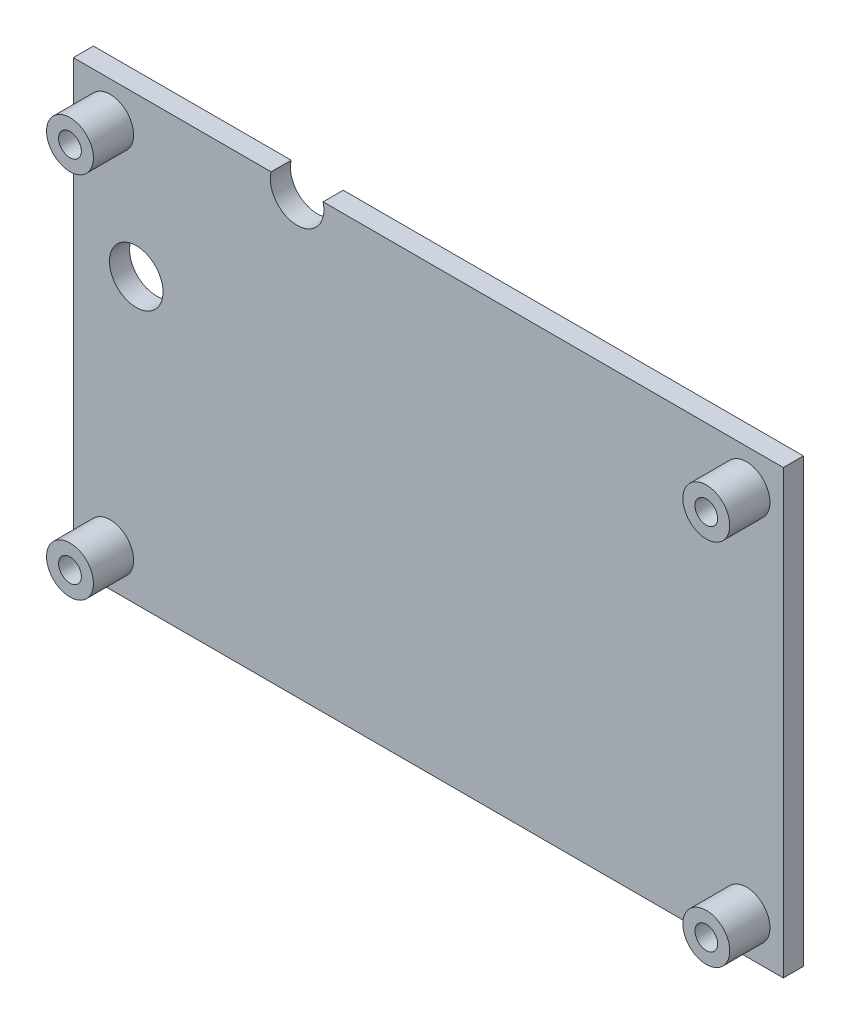
ISO-10303-21;
HEADER;
FILE_DESCRIPTION(('STEP AP214'),'2;1');
FILE_NAME('part.step','',(''),(''),'','','');
FILE_SCHEMA(('AUTOMOTIVE_DESIGN { 1 0 10303 214 1 1 1 1 }'));
ENDSEC;
DATA;
#1=APPLICATION_CONTEXT('core data for automotive mechanical design processes');
#2=APPLICATION_PROTOCOL_DEFINITION('international standard','automotive_design',2000,#1);
#3=PRODUCT_CONTEXT('',#1,'mechanical');
#4=PRODUCT('Part','Part','',(#3));
#5=PRODUCT_RELATED_PRODUCT_CATEGORY('part','',(#4));
#6=PRODUCT_DEFINITION_FORMATION('','',#4);
#7=PRODUCT_DEFINITION_CONTEXT('part definition',#1,'design');
#8=PRODUCT_DEFINITION('design','',#6,#7);
#9=PRODUCT_DEFINITION_SHAPE('','',#8);
#10=(LENGTH_UNIT() NAMED_UNIT(*) SI_UNIT(.MILLI.,.METRE.));
#11=(NAMED_UNIT(*) PLANE_ANGLE_UNIT() SI_UNIT($,.RADIAN.));
#12=(NAMED_UNIT(*) SI_UNIT($,.STERADIAN.) SOLID_ANGLE_UNIT());
#13=UNCERTAINTY_MEASURE_WITH_UNIT(LENGTH_MEASURE(1.E-05),#10,'distance_accuracy_value','');
#14=(GEOMETRIC_REPRESENTATION_CONTEXT(3) GLOBAL_UNCERTAINTY_ASSIGNED_CONTEXT((#13)) GLOBAL_UNIT_ASSIGNED_CONTEXT((#10,
#11,#12)) REPRESENTATION_CONTEXT('',''));
#15=CARTESIAN_POINT('',(0.,0.,0.));
#16=DIRECTION('',(0.,0.,1.));
#17=DIRECTION('',(1.,0.,0.));
#18=AXIS2_PLACEMENT_3D('',#15,#16,#17);
#19=CARTESIAN_POINT('',(124.5,-63.5,190.5));
#20=DIRECTION('',(0.,0.,1.));
#21=DIRECTION('',(1.,0.,0.));
#22=AXIS2_PLACEMENT_3D('',#19,#20,#21);
#23=PLANE('',#22);
#24=CARTESIAN_POINT('',(124.5,-63.5,190.5));
#25=DIRECTION('',(0.,0.,1.));
#26=DIRECTION('',(1.,0.,0.));
#27=AXIS2_PLACEMENT_3D('',#24,#25,#26);
#28=CIRCLE('',#27,1.7);
#29=CARTESIAN_POINT('',(126.2,-63.5,190.5));
#30=VERTEX_POINT('',#29);
#31=EDGE_CURVE('E10',#30,#30,#28,.T.);
#32=ORIENTED_EDGE('',*,*,#31,.F.);
#33=EDGE_LOOP('',(#32));
#34=FACE_BOUND('',#33,.T.);
#35=CARTESIAN_POINT('',(124.5,-63.5,190.5));
#36=DIRECTION('',(0.,0.,1.));
#37=DIRECTION('',(1.,0.,0.));
#38=AXIS2_PLACEMENT_3D('',#35,#36,#37);
#39=CIRCLE('',#38,3.5);
#40=CARTESIAN_POINT('',(128.,-63.5,190.5));
#41=VERTEX_POINT('',#40);
#42=EDGE_CURVE('E536',#41,#41,#39,.T.);
#43=ORIENTED_EDGE('',*,*,#42,.T.);
#44=EDGE_LOOP('',(#43));
#45=FACE_BOUND('',#44,.T.);
#46=ADVANCED_FACE('F15',(#34,#45),#23,.T.);
#47=CARTESIAN_POINT('',(29.5,-63.5,190.5));
#48=DIRECTION('',(0.,0.,1.));
#49=DIRECTION('',(1.,0.,0.));
#50=AXIS2_PLACEMENT_3D('',#47,#48,#49);
#51=PLANE('',#50);
#52=CARTESIAN_POINT('',(29.5,-63.5,190.5));
#53=DIRECTION('',(0.,0.,1.));
#54=DIRECTION('',(1.,0.,0.));
#55=AXIS2_PLACEMENT_3D('',#52,#53,#54);
#56=CIRCLE('',#55,1.7);
#57=CARTESIAN_POINT('',(31.2,-63.5,190.5));
#58=VERTEX_POINT('',#57);
#59=EDGE_CURVE('E19',#58,#58,#56,.T.);
#60=ORIENTED_EDGE('',*,*,#59,.F.);
#61=EDGE_LOOP('',(#60));
#62=FACE_BOUND('',#61,.T.);
#63=CARTESIAN_POINT('',(29.5,-63.5,190.5));
#64=DIRECTION('',(0.,0.,1.));
#65=DIRECTION('',(1.,0.,0.));
#66=AXIS2_PLACEMENT_3D('',#63,#64,#65);
#67=CIRCLE('',#66,3.5);
#68=CARTESIAN_POINT('',(33.,-63.5,190.5));
#69=VERTEX_POINT('',#68);
#70=EDGE_CURVE('E254',#69,#69,#67,.T.);
#71=ORIENTED_EDGE('',*,*,#70,.T.);
#72=EDGE_LOOP('',(#71));
#73=FACE_BOUND('',#72,.T.);
#74=ADVANCED_FACE('F416',(#62,#73),#51,.T.);
#75=CARTESIAN_POINT('',(124.5,-118.5,190.5));
#76=DIRECTION('',(0.,0.,1.));
#77=DIRECTION('',(1.,0.,0.));
#78=AXIS2_PLACEMENT_3D('',#75,#76,#77);
#79=PLANE('',#78);
#80=CARTESIAN_POINT('',(124.5,-118.5,190.5));
#81=DIRECTION('',(0.,0.,1.));
#82=DIRECTION('',(1.,0.,0.));
#83=AXIS2_PLACEMENT_3D('',#80,#81,#82);
#84=CIRCLE('',#83,1.7);
#85=CARTESIAN_POINT('',(126.2,-118.5,190.5));
#86=VERTEX_POINT('',#85);
#87=EDGE_CURVE('E244',#86,#86,#84,.T.);
#88=ORIENTED_EDGE('',*,*,#87,.F.);
#89=EDGE_LOOP('',(#88));
#90=FACE_BOUND('',#89,.T.);
#91=CARTESIAN_POINT('',(124.5,-118.5,190.5));
#92=DIRECTION('',(0.,0.,1.));
#93=DIRECTION('',(1.,0.,0.));
#94=AXIS2_PLACEMENT_3D('',#91,#92,#93);
#95=CIRCLE('',#94,3.5);
#96=CARTESIAN_POINT('',(128.,-118.5,190.5));
#97=VERTEX_POINT('',#96);
#98=EDGE_CURVE('E231',#97,#97,#95,.T.);
#99=ORIENTED_EDGE('',*,*,#98,.T.);
#100=EDGE_LOOP('',(#99));
#101=FACE_BOUND('',#100,.T.);
#102=ADVANCED_FACE('F17',(#90,#101),#79,.T.);
#103=CARTESIAN_POINT('',(29.5,-118.5,190.5));
#104=DIRECTION('',(0.,0.,1.));
#105=DIRECTION('',(1.,0.,0.));
#106=AXIS2_PLACEMENT_3D('',#103,#104,#105);
#107=PLANE('',#106);
#108=CARTESIAN_POINT('',(29.5,-118.5,190.5));
#109=DIRECTION('',(0.,0.,1.));
#110=DIRECTION('',(1.,0.,0.));
#111=AXIS2_PLACEMENT_3D('',#108,#109,#110);
#112=CIRCLE('',#111,1.7);
#113=CARTESIAN_POINT('',(31.2,-118.5,190.5));
#114=VERTEX_POINT('',#113);
#115=EDGE_CURVE('E240',#114,#114,#112,.T.);
#116=ORIENTED_EDGE('',*,*,#115,.F.);
#117=EDGE_LOOP('',(#116));
#118=FACE_BOUND('',#117,.T.);
#119=CARTESIAN_POINT('',(29.5,-118.5,190.5));
#120=DIRECTION('',(0.,0.,1.));
#121=DIRECTION('',(1.,0.,0.));
#122=AXIS2_PLACEMENT_3D('',#119,#120,#121);
#123=CIRCLE('',#122,3.5);
#124=CARTESIAN_POINT('',(33.,-118.5,190.5));
#125=VERTEX_POINT('',#124);
#126=EDGE_CURVE('E226',#125,#125,#123,.T.);
#127=ORIENTED_EDGE('',*,*,#126,.T.);
#128=EDGE_LOOP('',(#127));
#129=FACE_BOUND('',#128,.T.);
#130=ADVANCED_FACE('F366',(#118,#129),#107,.T.);
#131=CARTESIAN_POINT('',(124.5,-63.5,181.3));
#132=DIRECTION('',(0.,0.,1.));
#133=DIRECTION('',(1.,0.,0.));
#134=AXIS2_PLACEMENT_3D('',#131,#132,#133);
#135=CYLINDRICAL_SURFACE('',#134,1.7);
#136=DIRECTION('',(0.,0.,1.));
#137=VECTOR('',#136,1.);
#138=CARTESIAN_POINT('',(126.2,-63.5,181.3));
#139=LINE('',#138,#137);
#140=CARTESIAN_POINT('',(126.2,-63.5,181.5));
#141=VERTEX_POINT('',#140);
#142=EDGE_CURVE('E26',#141,#30,#139,.T.);
#143=ORIENTED_EDGE('',*,*,#142,.F.);
#144=CARTESIAN_POINT('',(124.5,-63.5,181.5));
#145=DIRECTION('',(0.,0.,1.));
#146=DIRECTION('',(1.,0.,0.));
#147=AXIS2_PLACEMENT_3D('',#144,#145,#146);
#148=CIRCLE('',#147,1.7);
#149=EDGE_CURVE('E161',#141,#141,#148,.T.);
#150=ORIENTED_EDGE('',*,*,#149,.F.);
#151=ORIENTED_EDGE('',*,*,#142,.T.);
#152=ORIENTED_EDGE('',*,*,#31,.T.);
#153=EDGE_LOOP('',(#143,#150,#151,#152));
#154=FACE_BOUND('',#153,.T.);
#155=ADVANCED_FACE('F371',(#154),#135,.F.);
#156=CARTESIAN_POINT('',(29.5,-63.5,181.3));
#157=DIRECTION('',(0.,0.,1.));
#158=DIRECTION('',(1.,0.,0.));
#159=AXIS2_PLACEMENT_3D('',#156,#157,#158);
#160=CYLINDRICAL_SURFACE('',#159,1.7);
#161=DIRECTION('',(0.,0.,1.));
#162=VECTOR('',#161,1.);
#163=CARTESIAN_POINT('',(31.2,-63.5,181.3));
#164=LINE('',#163,#162);
#165=CARTESIAN_POINT('',(31.2,-63.5,181.5));
#166=VERTEX_POINT('',#165);
#167=EDGE_CURVE('E246',#166,#58,#164,.T.);
#168=ORIENTED_EDGE('',*,*,#167,.F.);
#169=CARTESIAN_POINT('',(29.5,-63.5,181.5));
#170=DIRECTION('',(0.,0.,1.));
#171=DIRECTION('',(1.,0.,0.));
#172=AXIS2_PLACEMENT_3D('',#169,#170,#171);
#173=CIRCLE('',#172,1.7);
#174=EDGE_CURVE('E262',#166,#166,#173,.T.);
#175=ORIENTED_EDGE('',*,*,#174,.F.);
#176=ORIENTED_EDGE('',*,*,#167,.T.);
#177=ORIENTED_EDGE('',*,*,#59,.T.);
#178=EDGE_LOOP('',(#168,#175,#176,#177));
#179=FACE_BOUND('',#178,.T.);
#180=ADVANCED_FACE('F451',(#179),#160,.F.);
#181=CARTESIAN_POINT('',(124.5,-118.5,181.3));
#182=DIRECTION('',(0.,0.,1.));
#183=DIRECTION('',(1.,0.,0.));
#184=AXIS2_PLACEMENT_3D('',#181,#182,#183);
#185=CYLINDRICAL_SURFACE('',#184,1.7);
#186=DIRECTION('',(0.,0.,1.));
#187=VECTOR('',#186,1.);
#188=CARTESIAN_POINT('',(126.2,-118.5,181.3));
#189=LINE('',#188,#187);
#190=CARTESIAN_POINT('',(126.2,-118.5,181.5));
#191=VERTEX_POINT('',#190);
#192=EDGE_CURVE('E247',#191,#86,#189,.T.);
#193=ORIENTED_EDGE('',*,*,#192,.F.);
#194=CARTESIAN_POINT('',(124.5,-118.5,181.5));
#195=DIRECTION('',(0.,0.,1.));
#196=DIRECTION('',(1.,0.,0.));
#197=AXIS2_PLACEMENT_3D('',#194,#195,#196);
#198=CIRCLE('',#197,1.7);
#199=EDGE_CURVE('E194',#191,#191,#198,.T.);
#200=ORIENTED_EDGE('',*,*,#199,.F.);
#201=ORIENTED_EDGE('',*,*,#192,.T.);
#202=ORIENTED_EDGE('',*,*,#87,.T.);
#203=EDGE_LOOP('',(#193,#200,#201,#202));
#204=FACE_BOUND('',#203,.T.);
#205=ADVANCED_FACE('F446',(#204),#185,.F.);
#206=CARTESIAN_POINT('',(29.5,-118.5,181.3));
#207=DIRECTION('',(0.,0.,1.));
#208=DIRECTION('',(1.,0.,0.));
#209=AXIS2_PLACEMENT_3D('',#206,#207,#208);
#210=CYLINDRICAL_SURFACE('',#209,1.7);
#211=DIRECTION('',(0.,0.,1.));
#212=VECTOR('',#211,1.);
#213=CARTESIAN_POINT('',(31.2,-118.5,181.3));
#214=LINE('',#213,#212);
#215=CARTESIAN_POINT('',(31.2,-118.5,181.5));
#216=VERTEX_POINT('',#215);
#217=EDGE_CURVE('E236',#216,#114,#214,.T.);
#218=ORIENTED_EDGE('',*,*,#217,.F.);
#219=CARTESIAN_POINT('',(29.5,-118.5,181.5));
#220=DIRECTION('',(0.,0.,1.));
#221=DIRECTION('',(1.,0.,0.));
#222=AXIS2_PLACEMENT_3D('',#219,#220,#221);
#223=CIRCLE('',#222,1.7);
#224=EDGE_CURVE('E199',#216,#216,#223,.T.);
#225=ORIENTED_EDGE('',*,*,#224,.F.);
#226=ORIENTED_EDGE('',*,*,#217,.T.);
#227=ORIENTED_EDGE('',*,*,#115,.T.);
#228=EDGE_LOOP('',(#218,#225,#226,#227));
#229=FACE_BOUND('',#228,.T.);
#230=ADVANCED_FACE('F357',(#229),#210,.F.);
#231=CARTESIAN_POINT('',(124.5,-63.5,184.5));
#232=DIRECTION('',(0.,0.,1.));
#233=DIRECTION('',(1.,0.,0.));
#234=AXIS2_PLACEMENT_3D('',#231,#232,#233);
#235=CYLINDRICAL_SURFACE('',#234,3.5);
#236=ORIENTED_EDGE('',*,*,#42,.F.);
#237=DIRECTION('',(0.,0.,1.));
#238=VECTOR('',#237,1.);
#239=CARTESIAN_POINT('',(128.,-63.5,184.5));
#240=LINE('',#239,#238);
#241=CARTESIAN_POINT('',(128.,-63.5,184.5));
#242=VERTEX_POINT('',#241);
#243=EDGE_CURVE('E188',#242,#41,#240,.T.);
#244=ORIENTED_EDGE('',*,*,#243,.F.);
#245=CARTESIAN_POINT('',(124.5,-63.5,184.5));
#246=DIRECTION('',(0.,0.,1.));
#247=DIRECTION('',(1.,0.,0.));
#248=AXIS2_PLACEMENT_3D('',#245,#246,#247);
#249=CIRCLE('',#248,3.5);
#250=EDGE_CURVE('E222',#242,#242,#249,.T.);
#251=ORIENTED_EDGE('',*,*,#250,.T.);
#252=ORIENTED_EDGE('',*,*,#243,.T.);
#253=EDGE_LOOP('',(#236,#244,#251,#252));
#254=FACE_BOUND('',#253,.T.);
#255=ADVANCED_FACE('F351',(#254),#235,.T.);
#256=CARTESIAN_POINT('',(29.5,-63.5,184.5));
#257=DIRECTION('',(0.,0.,1.));
#258=DIRECTION('',(1.,0.,0.));
#259=AXIS2_PLACEMENT_3D('',#256,#257,#258);
#260=CYLINDRICAL_SURFACE('',#259,3.5);
#261=ORIENTED_EDGE('',*,*,#70,.F.);
#262=DIRECTION('',(0.,0.,1.));
#263=VECTOR('',#262,1.);
#264=CARTESIAN_POINT('',(33.,-63.5,184.5));
#265=LINE('',#264,#263);
#266=CARTESIAN_POINT('',(33.,-63.5,184.5));
#267=VERTEX_POINT('',#266);
#268=EDGE_CURVE('E539',#267,#69,#265,.T.);
#269=ORIENTED_EDGE('',*,*,#268,.F.);
#270=CARTESIAN_POINT('',(29.5,-63.5,184.5));
#271=DIRECTION('',(0.,0.,1.));
#272=DIRECTION('',(1.,0.,0.));
#273=AXIS2_PLACEMENT_3D('',#270,#271,#272);
#274=CIRCLE('',#273,3.5);
#275=EDGE_CURVE('E218',#267,#267,#274,.T.);
#276=ORIENTED_EDGE('',*,*,#275,.T.);
#277=ORIENTED_EDGE('',*,*,#268,.T.);
#278=EDGE_LOOP('',(#261,#269,#276,#277));
#279=FACE_BOUND('',#278,.T.);
#280=ADVANCED_FACE('F356',(#279),#260,.T.);
#281=CARTESIAN_POINT('',(33.395041838792,-81.61238399835,181.4));
#282=DIRECTION('',(0.,0.,1.));
#283=DIRECTION('',(1.,0.,0.));
#284=AXIS2_PLACEMENT_3D('',#281,#282,#283);
#285=CYLINDRICAL_SURFACE('',#284,4.);
#286=DIRECTION('',(0.,0.,1.));
#287=VECTOR('',#286,1.);
#288=CARTESIAN_POINT('',(37.395041838792,-81.61238399835,181.4));
#289=LINE('',#288,#287);
#290=CARTESIAN_POINT('',(37.395041838792,-81.61238399835,181.5));
#291=VERTEX_POINT('',#290);
#292=CARTESIAN_POINT('',(37.395041838792,-81.61238399835,184.5));
#293=VERTEX_POINT('',#292);
#294=EDGE_CURVE('E251',#291,#293,#289,.T.);
#295=ORIENTED_EDGE('',*,*,#294,.F.);
#296=CARTESIAN_POINT('',(33.395041838792,-81.61238399835,181.5));
#297=DIRECTION('',(0.,0.,1.));
#298=DIRECTION('',(1.,0.,0.));
#299=AXIS2_PLACEMENT_3D('',#296,#297,#298);
#300=CIRCLE('',#299,4.);
#301=EDGE_CURVE('E198',#291,#291,#300,.T.);
#302=ORIENTED_EDGE('',*,*,#301,.F.);
#303=ORIENTED_EDGE('',*,*,#294,.T.);
#304=CARTESIAN_POINT('',(33.395041838792,-81.61238399835,184.5));
#305=DIRECTION('',(0.,0.,1.));
#306=DIRECTION('',(1.,0.,0.));
#307=AXIS2_PLACEMENT_3D('',#304,#305,#306);
#308=CIRCLE('',#307,4.);
#309=EDGE_CURVE('E207',#293,#293,#308,.T.);
#310=ORIENTED_EDGE('',*,*,#309,.T.);
#311=EDGE_LOOP('',(#295,#302,#303,#310));
#312=FACE_BOUND('',#311,.T.);
#313=ADVANCED_FACE('F462',(#312),#285,.F.);
#314=CARTESIAN_POINT('',(124.5,-118.5,184.5));
#315=DIRECTION('',(0.,0.,1.));
#316=DIRECTION('',(1.,0.,0.));
#317=AXIS2_PLACEMENT_3D('',#314,#315,#316);
#318=CYLINDRICAL_SURFACE('',#317,3.5);
#319=ORIENTED_EDGE('',*,*,#98,.F.);
#320=DIRECTION('',(0.,0.,1.));
#321=VECTOR('',#320,1.);
#322=CARTESIAN_POINT('',(128.,-118.5,184.5));
#323=LINE('',#322,#321);
#324=CARTESIAN_POINT('',(128.,-118.5,184.5));
#325=VERTEX_POINT('',#324);
#326=EDGE_CURVE('E234',#325,#97,#323,.T.);
#327=ORIENTED_EDGE('',*,*,#326,.F.);
#328=CARTESIAN_POINT('',(124.5,-118.5,184.5));
#329=DIRECTION('',(0.,0.,1.));
#330=DIRECTION('',(1.,0.,0.));
#331=AXIS2_PLACEMENT_3D('',#328,#329,#330);
#332=CIRCLE('',#331,3.5);
#333=EDGE_CURVE('E203',#325,#325,#332,.T.);
#334=ORIENTED_EDGE('',*,*,#333,.T.);
#335=ORIENTED_EDGE('',*,*,#326,.T.);
#336=EDGE_LOOP('',(#319,#327,#334,#335));
#337=FACE_BOUND('',#336,.T.);
#338=ADVANCED_FACE('F342',(#337),#318,.T.);
#339=CARTESIAN_POINT('',(29.5,-118.5,184.5));
#340=DIRECTION('',(0.,0.,1.));
#341=DIRECTION('',(1.,0.,0.));
#342=AXIS2_PLACEMENT_3D('',#339,#340,#341);
#343=CYLINDRICAL_SURFACE('',#342,3.5);
#344=ORIENTED_EDGE('',*,*,#126,.F.);
#345=DIRECTION('',(0.,0.,1.));
#346=VECTOR('',#345,1.);
#347=CARTESIAN_POINT('',(33.,-118.5,184.5));
#348=LINE('',#347,#346);
#349=CARTESIAN_POINT('',(33.,-118.5,184.5));
#350=VERTEX_POINT('',#349);
#351=EDGE_CURVE('E230',#350,#125,#348,.T.);
#352=ORIENTED_EDGE('',*,*,#351,.F.);
#353=CARTESIAN_POINT('',(29.5,-118.5,184.5));
#354=DIRECTION('',(0.,0.,1.));
#355=DIRECTION('',(1.,0.,0.));
#356=AXIS2_PLACEMENT_3D('',#353,#354,#355);
#357=CIRCLE('',#356,3.5);
#358=EDGE_CURVE('E202',#350,#350,#357,.T.);
#359=ORIENTED_EDGE('',*,*,#358,.T.);
#360=ORIENTED_EDGE('',*,*,#351,.T.);
#361=EDGE_LOOP('',(#344,#352,#359,#360));
#362=FACE_BOUND('',#361,.T.);
#363=ADVANCED_FACE('F337',(#362),#343,.T.);
#364=CARTESIAN_POINT('',(24.,-58.,181.5));
#365=DIRECTION('',(0.,1.,0.));
#366=DIRECTION('',(1.,0.,0.));
#367=AXIS2_PLACEMENT_3D('',#364,#365,#366);
#368=PLANE('',#367);
#369=DIRECTION('',(1.,0.,0.));
#370=VECTOR('',#369,1.);
#371=CARTESIAN_POINT('',(24.,-58.,181.5));
#372=LINE('',#371,#370);
#373=CARTESIAN_POINT('',(61.289539526292,-58.,181.5));
#374=VERTEX_POINT('',#373);
#375=CARTESIAN_POINT('',(130.,-58.,181.5));
#376=VERTEX_POINT('',#375);
#377=EDGE_CURVE('E261',#374,#376,#372,.T.);
#378=ORIENTED_EDGE('',*,*,#377,.F.);
#379=DIRECTION('',(0.,0.,1.));
#380=VECTOR('',#379,1.);
#381=CARTESIAN_POINT('',(61.289539526292,-58.,181.4));
#382=LINE('',#381,#380);
#383=CARTESIAN_POINT('',(61.289539526292,-58.,184.5));
#384=VERTEX_POINT('',#383);
#385=EDGE_CURVE('E160',#374,#384,#382,.T.);
#386=ORIENTED_EDGE('',*,*,#385,.T.);
#387=DIRECTION('',(1.,0.,0.));
#388=VECTOR('',#387,1.);
#389=CARTESIAN_POINT('',(24.,-58.,184.5));
#390=LINE('',#389,#388);
#391=CARTESIAN_POINT('',(130.,-58.,184.5));
#392=VERTEX_POINT('',#391);
#393=EDGE_CURVE('E164',#384,#392,#390,.T.);
#394=ORIENTED_EDGE('',*,*,#393,.T.);
#395=DIRECTION('',(0.,0.,1.));
#396=VECTOR('',#395,1.);
#397=CARTESIAN_POINT('',(130.,-58.,181.5));
#398=LINE('',#397,#396);
#399=EDGE_CURVE('E148',#376,#392,#398,.T.);
#400=ORIENTED_EDGE('',*,*,#399,.F.);
#401=EDGE_LOOP('',(#378,#386,#394,#400));
#402=FACE_BOUND('',#401,.T.);
#403=ADVANCED_FACE('F165',(#402),#368,.T.);
#404=CARTESIAN_POINT('',(57.41154284148,-58.98037835175,181.4));
#405=DIRECTION('',(0.,0.,1.));
#406=DIRECTION('',(1.,0.,0.));
#407=AXIS2_PLACEMENT_3D('',#404,#405,#406);
#408=CYLINDRICAL_SURFACE('',#407,4.);
#409=DIRECTION('',(0.,0.,1.));
#410=VECTOR('',#409,1.);
#411=CARTESIAN_POINT('',(53.533546156668,-58.,181.4));
#412=LINE('',#411,#410);
#413=CARTESIAN_POINT('',(53.533546156668,-58.,181.5));
#414=VERTEX_POINT('',#413);
#415=CARTESIAN_POINT('',(53.533546156668,-58.,184.5));
#416=VERTEX_POINT('',#415);
#417=EDGE_CURVE('E208',#414,#416,#412,.T.);
#418=ORIENTED_EDGE('',*,*,#417,.T.);
#419=CARTESIAN_POINT('',(57.41154284148,-58.98037835175,184.5));
#420=DIRECTION('',(0.,0.,-1.));
#421=DIRECTION('',(0.969499171202858,0.245094587938964,0.));
#422=AXIS2_PLACEMENT_3D('',#419,#420,#421);
#423=CIRCLE('',#422,4.);
#424=EDGE_CURVE('E170',#384,#416,#423,.T.);
#425=ORIENTED_EDGE('',*,*,#424,.F.);
#426=ORIENTED_EDGE('',*,*,#385,.F.);
#427=CARTESIAN_POINT('',(57.41154284148,-58.98037835175,181.5));
#428=DIRECTION('',(0.,0.,1.));
#429=DIRECTION('',(-0.969499171202858,0.245094587938964,0.));
#430=AXIS2_PLACEMENT_3D('',#427,#428,#429);
#431=CIRCLE('',#430,4.);
#432=EDGE_CURVE('E211',#414,#374,#431,.T.);
#433=ORIENTED_EDGE('',*,*,#432,.F.);
#434=EDGE_LOOP('',(#418,#425,#426,#433));
#435=FACE_BOUND('',#434,.T.);
#436=ADVANCED_FACE('F401',(#435),#408,.F.);
#437=CARTESIAN_POINT('',(130.,-124.,181.5));
#438=DIRECTION('',(1.,0.,0.));
#439=DIRECTION('',(0.,1.,0.));
#440=AXIS2_PLACEMENT_3D('',#437,#438,#439);
#441=PLANE('',#440);
#442=DIRECTION('',(0.,0.,1.));
#443=VECTOR('',#442,1.);
#444=CARTESIAN_POINT('',(130.,-124.,181.5));
#445=LINE('',#444,#443);
#446=CARTESIAN_POINT('',(130.,-124.,181.5));
#447=VERTEX_POINT('',#446);
#448=CARTESIAN_POINT('',(130.,-124.,184.5));
#449=VERTEX_POINT('',#448);
#450=EDGE_CURVE('E192',#447,#449,#445,.T.);
#451=ORIENTED_EDGE('',*,*,#450,.F.);
#452=DIRECTION('',(0.,1.,0.));
#453=VECTOR('',#452,1.);
#454=CARTESIAN_POINT('',(130.,-124.,181.5));
#455=LINE('',#454,#453);
#456=EDGE_CURVE('E155',#447,#376,#455,.T.);
#457=ORIENTED_EDGE('',*,*,#456,.T.);
#458=ORIENTED_EDGE('',*,*,#399,.T.);
#459=DIRECTION('',(0.,1.,0.));
#460=VECTOR('',#459,1.);
#461=CARTESIAN_POINT('',(130.,-124.,184.5));
#462=LINE('',#461,#460);
#463=EDGE_CURVE('E153',#449,#392,#462,.T.);
#464=ORIENTED_EDGE('',*,*,#463,.F.);
#465=EDGE_LOOP('',(#451,#457,#458,#464));
#466=FACE_BOUND('',#465,.T.);
#467=ADVANCED_FACE('F151',(#466),#441,.T.);
#468=CARTESIAN_POINT('',(24.,-124.,181.5));
#469=DIRECTION('',(0.,0.,1.));
#470=DIRECTION('',(1.,0.,0.));
#471=AXIS2_PLACEMENT_3D('',#468,#469,#470);
#472=PLANE('',#471);
#473=ORIENTED_EDGE('',*,*,#149,.T.);
#474=EDGE_LOOP('',(#473));
#475=FACE_BOUND('',#474,.T.);
#476=ORIENTED_EDGE('',*,*,#174,.T.);
#477=EDGE_LOOP('',(#476));
#478=FACE_BOUND('',#477,.T.);
#479=ORIENTED_EDGE('',*,*,#301,.T.);
#480=EDGE_LOOP('',(#479));
#481=FACE_BOUND('',#480,.T.);
#482=ORIENTED_EDGE('',*,*,#199,.T.);
#483=EDGE_LOOP('',(#482));
#484=FACE_BOUND('',#483,.T.);
#485=ORIENTED_EDGE('',*,*,#224,.T.);
#486=EDGE_LOOP('',(#485));
#487=FACE_BOUND('',#486,.T.);
#488=ORIENTED_EDGE('',*,*,#432,.T.);
#489=ORIENTED_EDGE('',*,*,#377,.T.);
#490=ORIENTED_EDGE('',*,*,#456,.F.);
#491=DIRECTION('',(1.,0.,0.));
#492=VECTOR('',#491,1.);
#493=CARTESIAN_POINT('',(24.,-124.,181.5));
#494=LINE('',#493,#492);
#495=CARTESIAN_POINT('',(24.,-124.,181.5));
#496=VERTEX_POINT('',#495);
#497=EDGE_CURVE('E184',#496,#447,#494,.T.);
#498=ORIENTED_EDGE('',*,*,#497,.F.);
#499=DIRECTION('',(0.,1.,0.));
#500=VECTOR('',#499,1.);
#501=CARTESIAN_POINT('',(24.,-124.,181.5));
#502=LINE('',#501,#500);
#503=CARTESIAN_POINT('',(24.,-58.,181.5));
#504=VERTEX_POINT('',#503);
#505=EDGE_CURVE('E193',#496,#504,#502,.T.);
#506=ORIENTED_EDGE('',*,*,#505,.T.);
#507=DIRECTION('',(1.,0.,0.));
#508=VECTOR('',#507,1.);
#509=CARTESIAN_POINT('',(24.,-58.,181.5));
#510=LINE('',#509,#508);
#511=EDGE_CURVE('E212',#504,#414,#510,.T.);
#512=ORIENTED_EDGE('',*,*,#511,.T.);
#513=EDGE_LOOP('',(#488,#489,#490,#498,#506,#512));
#514=FACE_BOUND('',#513,.T.);
#515=ADVANCED_FACE('F323',(#475,#478,#481,#484,#487,#514),#472,.F.);
#516=CARTESIAN_POINT('',(24.,-58.,181.5));
#517=DIRECTION('',(0.,1.,0.));
#518=DIRECTION('',(1.,0.,0.));
#519=AXIS2_PLACEMENT_3D('',#516,#517,#518);
#520=PLANE('',#519);
#521=ORIENTED_EDGE('',*,*,#511,.F.);
#522=DIRECTION('',(0.,0.,1.));
#523=VECTOR('',#522,1.);
#524=CARTESIAN_POINT('',(24.,-58.,181.5));
#525=LINE('',#524,#523);
#526=CARTESIAN_POINT('',(24.,-58.,184.5));
#527=VERTEX_POINT('',#526);
#528=EDGE_CURVE('E217',#504,#527,#525,.T.);
#529=ORIENTED_EDGE('',*,*,#528,.T.);
#530=DIRECTION('',(1.,0.,0.));
#531=VECTOR('',#530,1.);
#532=CARTESIAN_POINT('',(24.,-58.,184.5));
#533=LINE('',#532,#531);
#534=EDGE_CURVE('E177',#527,#416,#533,.T.);
#535=ORIENTED_EDGE('',*,*,#534,.T.);
#536=ORIENTED_EDGE('',*,*,#417,.F.);
#537=EDGE_LOOP('',(#521,#529,#535,#536));
#538=FACE_BOUND('',#537,.T.);
#539=ADVANCED_FACE('F328',(#538),#520,.T.);
#540=CARTESIAN_POINT('',(24.,-124.,184.5));
#541=DIRECTION('',(0.,0.,1.));
#542=DIRECTION('',(1.,0.,0.));
#543=AXIS2_PLACEMENT_3D('',#540,#541,#542);
#544=PLANE('',#543);
#545=ORIENTED_EDGE('',*,*,#250,.F.);
#546=EDGE_LOOP('',(#545));
#547=FACE_BOUND('',#546,.T.);
#548=ORIENTED_EDGE('',*,*,#275,.F.);
#549=EDGE_LOOP('',(#548));
#550=FACE_BOUND('',#549,.T.);
#551=ORIENTED_EDGE('',*,*,#309,.F.);
#552=EDGE_LOOP('',(#551));
#553=FACE_BOUND('',#552,.T.);
#554=ORIENTED_EDGE('',*,*,#333,.F.);
#555=EDGE_LOOP('',(#554));
#556=FACE_BOUND('',#555,.T.);
#557=ORIENTED_EDGE('',*,*,#358,.F.);
#558=EDGE_LOOP('',(#557));
#559=FACE_BOUND('',#558,.T.);
#560=ORIENTED_EDGE('',*,*,#534,.F.);
#561=DIRECTION('',(0.,1.,0.));
#562=VECTOR('',#561,1.);
#563=CARTESIAN_POINT('',(24.,-124.,184.5));
#564=LINE('',#563,#562);
#565=CARTESIAN_POINT('',(24.,-124.,184.5));
#566=VERTEX_POINT('',#565);
#567=EDGE_CURVE('E213',#566,#527,#564,.T.);
#568=ORIENTED_EDGE('',*,*,#567,.F.);
#569=DIRECTION('',(1.,0.,0.));
#570=VECTOR('',#569,1.);
#571=CARTESIAN_POINT('',(24.,-124.,184.5));
#572=LINE('',#571,#570);
#573=EDGE_CURVE('E174',#566,#449,#572,.T.);
#574=ORIENTED_EDGE('',*,*,#573,.T.);
#575=ORIENTED_EDGE('',*,*,#463,.T.);
#576=ORIENTED_EDGE('',*,*,#393,.F.);
#577=ORIENTED_EDGE('',*,*,#424,.T.);
#578=EDGE_LOOP('',(#560,#568,#574,#575,#576,#577));
#579=FACE_BOUND('',#578,.T.);
#580=ADVANCED_FACE('F172',(#547,#550,#553,#556,#559,#579),#544,.T.);
#581=CARTESIAN_POINT('',(24.,-124.,181.5));
#582=DIRECTION('',(0.,1.,0.));
#583=DIRECTION('',(1.,0.,0.));
#584=AXIS2_PLACEMENT_3D('',#581,#582,#583);
#585=PLANE('',#584);
#586=ORIENTED_EDGE('',*,*,#450,.T.);
#587=ORIENTED_EDGE('',*,*,#573,.F.);
#588=DIRECTION('',(0.,0.,1.));
#589=VECTOR('',#588,1.);
#590=CARTESIAN_POINT('',(24.,-124.,181.5));
#591=LINE('',#590,#589);
#592=EDGE_CURVE('E189',#496,#566,#591,.T.);
#593=ORIENTED_EDGE('',*,*,#592,.F.);
#594=ORIENTED_EDGE('',*,*,#497,.T.);
#595=EDGE_LOOP('',(#586,#587,#593,#594));
#596=FACE_BOUND('',#595,.T.);
#597=ADVANCED_FACE('F306',(#596),#585,.F.);
#598=CARTESIAN_POINT('',(24.,-124.,181.5));
#599=DIRECTION('',(1.,0.,0.));
#600=DIRECTION('',(0.,1.,0.));
#601=AXIS2_PLACEMENT_3D('',#598,#599,#600);
#602=PLANE('',#601);
#603=ORIENTED_EDGE('',*,*,#567,.T.);
#604=ORIENTED_EDGE('',*,*,#528,.F.);
#605=ORIENTED_EDGE('',*,*,#505,.F.);
#606=ORIENTED_EDGE('',*,*,#592,.T.);
#607=EDGE_LOOP('',(#603,#604,#605,#606));
#608=FACE_BOUND('',#607,.T.);
#609=ADVANCED_FACE('F312',(#608),#602,.F.);
#610=CLOSED_SHELL('',(#46,#74,#102,#130,#155,#180,#205,#230,#255,#280,#313,#338,#363,#403,#436,
#467,#515,#539,#580,#597,#609));
#611=MANIFOLD_SOLID_BREP('B1',#610);
#612=ADVANCED_BREP_SHAPE_REPRESENTATION('',(#18,#611),#14);
#613=SHAPE_DEFINITION_REPRESENTATION(#9,#612);
ENDSEC;
END-ISO-10303-21;
